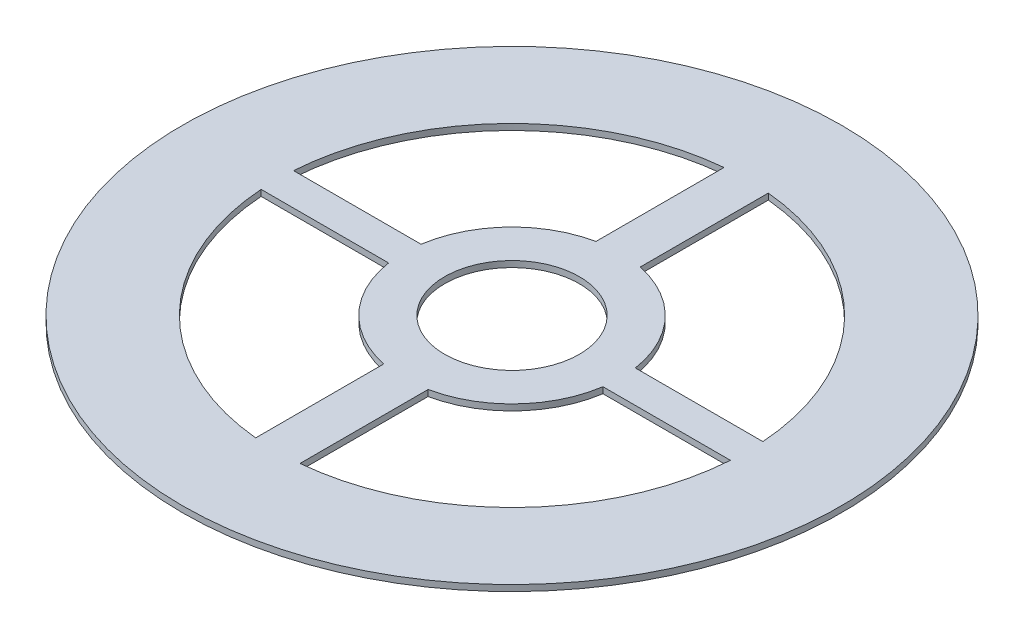
ISO-10303-21;
HEADER;
FILE_DESCRIPTION(('STEP AP214'),'2;1');
FILE_NAME('part.step','',(''),(''),'','','');
FILE_SCHEMA(('AUTOMOTIVE_DESIGN { 1 0 10303 214 1 1 1 1 }'));
ENDSEC;
DATA;
#1=APPLICATION_CONTEXT('core data for automotive mechanical design processes');
#2=APPLICATION_PROTOCOL_DEFINITION('international standard','automotive_design',2000,#1);
#3=PRODUCT_CONTEXT('',#1,'mechanical');
#4=PRODUCT('Part','Part','',(#3));
#5=PRODUCT_RELATED_PRODUCT_CATEGORY('part','',(#4));
#6=PRODUCT_DEFINITION_FORMATION('','',#4);
#7=PRODUCT_DEFINITION_CONTEXT('part definition',#1,'design');
#8=PRODUCT_DEFINITION('design','',#6,#7);
#9=PRODUCT_DEFINITION_SHAPE('','',#8);
#10=(LENGTH_UNIT() NAMED_UNIT(*) SI_UNIT(.MILLI.,.METRE.));
#11=(NAMED_UNIT(*) PLANE_ANGLE_UNIT() SI_UNIT($,.RADIAN.));
#12=(NAMED_UNIT(*) SI_UNIT($,.STERADIAN.) SOLID_ANGLE_UNIT());
#13=UNCERTAINTY_MEASURE_WITH_UNIT(LENGTH_MEASURE(1.E-05),#10,'distance_accuracy_value','');
#14=(GEOMETRIC_REPRESENTATION_CONTEXT(3) GLOBAL_UNCERTAINTY_ASSIGNED_CONTEXT((#13)) GLOBAL_UNIT_ASSIGNED_CONTEXT((#10,
#11,#12)) REPRESENTATION_CONTEXT('',''));
#15=CARTESIAN_POINT('',(0.,0.,0.));
#16=DIRECTION('',(0.,0.,1.));
#17=DIRECTION('',(1.,0.,0.));
#18=AXIS2_PLACEMENT_3D('',#15,#16,#17);
#19=CARTESIAN_POINT('',(0.,3.,0.));
#20=DIRECTION('',(0.,1.,0.));
#21=DIRECTION('',(0.,0.,1.));
#22=AXIS2_PLACEMENT_3D('',#19,#20,#21);
#23=PLANE('',#22);
#24=DIRECTION('',(1.,0.,0.));
#25=VECTOR('',#24,1.);
#26=CARTESIAN_POINT('',(-115.082927495968,3.,-7.95600567614442));
#27=LINE('',#26,#25);
#28=CARTESIAN_POINT('',(-115.082927495968,3.,-7.95600567614442));
#29=VERTEX_POINT('',#28);
#30=CARTESIAN_POINT('',(-52.5482500782004,3.,-7.95600567614442));
#31=VERTEX_POINT('',#30);
#32=EDGE_CURVE('E252',#29,#31,#27,.T.);
#33=ORIENTED_EDGE('',*,*,#32,.F.);
#34=CARTESIAN_POINT('',(0.,3.,0.));
#35=DIRECTION('',(0.,1.,0.));
#36=DIRECTION('',(0.,0.,1.));
#37=AXIS2_PLACEMENT_3D('',#34,#35,#36);
#38=CIRCLE('',#37,115.357610183988);
#39=CARTESIAN_POINT('',(-10.860579176959,3.,-114.845226488967));
#40=VERTEX_POINT('',#39);
#41=EDGE_CURVE('E250',#40,#29,#38,.T.);
#42=ORIENTED_EDGE('',*,*,#41,.F.);
#43=DIRECTION('',(0.,0.,-1.));
#44=VECTOR('',#43,1.);
#45=CARTESIAN_POINT('',(-10.860579176959,3.,-52.0256132356067));
#46=LINE('',#45,#44);
#47=CARTESIAN_POINT('',(-10.860579176959,3.,-52.0256132356067));
#48=VERTEX_POINT('',#47);
#49=EDGE_CURVE('E258',#48,#40,#46,.T.);
#50=ORIENTED_EDGE('',*,*,#49,.F.);
#51=CARTESIAN_POINT('',(0.,3.,0.));
#52=DIRECTION('',(0.,-1.,0.));
#53=DIRECTION('',(0.,0.,1.));
#54=AXIS2_PLACEMENT_3D('',#51,#52,#53);
#55=CIRCLE('',#54,53.1471223360205);
#56=EDGE_CURVE('E255',#31,#48,#55,.T.);
#57=ORIENTED_EDGE('',*,*,#56,.F.);
#58=EDGE_LOOP('',(#33,#42,#50,#57));
#59=FACE_BOUND('',#58,.T.);
#60=CARTESIAN_POINT('',(0.,3.,0.));
#61=DIRECTION('',(0.,1.,0.));
#62=DIRECTION('',(0.,0.,1.));
#63=AXIS2_PLACEMENT_3D('',#60,#61,#62);
#64=CIRCLE('',#63,161.62626275878);
#65=CARTESIAN_POINT('',(0.,3.,161.62626275878));
#66=VERTEX_POINT('',#65);
#67=EDGE_CURVE('E11',#66,#66,#64,.T.);
#68=ORIENTED_EDGE('',*,*,#67,.T.);
#69=EDGE_LOOP('',(#68));
#70=FACE_BOUND('',#69,.T.);
#71=CARTESIAN_POINT('',(0.,3.,0.));
#72=DIRECTION('',(0.,1.,0.));
#73=DIRECTION('',(0.,0.,1.));
#74=AXIS2_PLACEMENT_3D('',#71,#72,#73);
#75=CIRCLE('',#74,33.0195723251386);
#76=CARTESIAN_POINT('',(0.,3.,33.0195723251386));
#77=VERTEX_POINT('',#76);
#78=EDGE_CURVE('E244',#77,#77,#75,.T.);
#79=ORIENTED_EDGE('',*,*,#78,.F.);
#80=EDGE_LOOP('',(#79));
#81=FACE_BOUND('',#80,.T.);
#82=DIRECTION('',(0.,0.,1.));
#83=VECTOR('',#82,1.);
#84=CARTESIAN_POINT('',(10.860579176959,3.,114.845226488967));
#85=LINE('',#84,#83);
#86=CARTESIAN_POINT('',(10.860579176959,3.,52.0256132356067));
#87=VERTEX_POINT('',#86);
#88=CARTESIAN_POINT('',(10.860579176959,3.,114.845226488967));
#89=VERTEX_POINT('',#88);
#90=EDGE_CURVE('E215',#87,#89,#85,.T.);
#91=ORIENTED_EDGE('',*,*,#90,.F.);
#92=CARTESIAN_POINT('',(0.,3.,0.));
#93=DIRECTION('',(0.,-1.,0.));
#94=DIRECTION('',(0.,0.,1.));
#95=AXIS2_PLACEMENT_3D('',#92,#93,#94);
#96=CIRCLE('',#95,53.1471223360205);
#97=CARTESIAN_POINT('',(52.5482500782004,3.,7.95600567614442));
#98=VERTEX_POINT('',#97);
#99=EDGE_CURVE('E213',#98,#87,#96,.T.);
#100=ORIENTED_EDGE('',*,*,#99,.F.);
#101=DIRECTION('',(-1.,0.,0.));
#102=VECTOR('',#101,1.);
#103=CARTESIAN_POINT('',(52.5482500782004,3.,7.95600567614442));
#104=LINE('',#103,#102);
#105=CARTESIAN_POINT('',(115.082927495968,3.,7.95600567614442));
#106=VERTEX_POINT('',#105);
#107=EDGE_CURVE('E221',#106,#98,#104,.T.);
#108=ORIENTED_EDGE('',*,*,#107,.F.);
#109=CARTESIAN_POINT('',(0.,3.,0.));
#110=DIRECTION('',(0.,1.,0.));
#111=DIRECTION('',(0.,0.,1.));
#112=AXIS2_PLACEMENT_3D('',#109,#110,#111);
#113=CIRCLE('',#112,115.357610183988);
#114=EDGE_CURVE('E218',#89,#106,#113,.T.);
#115=ORIENTED_EDGE('',*,*,#114,.F.);
#116=EDGE_LOOP('',(#91,#100,#108,#115));
#117=FACE_BOUND('',#116,.T.);
#118=DIRECTION('',(-1.,0.,0.));
#119=VECTOR('',#118,1.);
#120=CARTESIAN_POINT('',(-115.082927495968,3.,7.95600567614442));
#121=LINE('',#120,#119);
#122=CARTESIAN_POINT('',(-52.5482500782004,3.,7.95600567614442));
#123=VERTEX_POINT('',#122);
#124=CARTESIAN_POINT('',(-115.082927495968,3.,7.95600567614442));
#125=VERTEX_POINT('',#124);
#126=EDGE_CURVE('E184',#123,#125,#121,.T.);
#127=ORIENTED_EDGE('',*,*,#126,.F.);
#128=CARTESIAN_POINT('',(0.,3.,0.));
#129=DIRECTION('',(0.,-1.,0.));
#130=DIRECTION('',(0.,0.,1.));
#131=AXIS2_PLACEMENT_3D('',#128,#129,#130);
#132=CIRCLE('',#131,53.1471223360205);
#133=CARTESIAN_POINT('',(-10.860579176959,3.,52.0256132356067));
#134=VERTEX_POINT('',#133);
#135=EDGE_CURVE('E182',#134,#123,#132,.T.);
#136=ORIENTED_EDGE('',*,*,#135,.F.);
#137=DIRECTION('',(0.,0.,-1.));
#138=VECTOR('',#137,1.);
#139=CARTESIAN_POINT('',(-10.860579176959,3.,114.845226488967));
#140=LINE('',#139,#138);
#141=CARTESIAN_POINT('',(-10.860579176959,3.,114.845226488967));
#142=VERTEX_POINT('',#141);
#143=EDGE_CURVE('E190',#142,#134,#140,.T.);
#144=ORIENTED_EDGE('',*,*,#143,.F.);
#145=CARTESIAN_POINT('',(0.,3.,0.));
#146=DIRECTION('',(0.,1.,0.));
#147=DIRECTION('',(0.,0.,1.));
#148=AXIS2_PLACEMENT_3D('',#145,#146,#147);
#149=CIRCLE('',#148,115.357610183988);
#150=EDGE_CURVE('E187',#125,#142,#149,.T.);
#151=ORIENTED_EDGE('',*,*,#150,.F.);
#152=EDGE_LOOP('',(#127,#136,#144,#151));
#153=FACE_BOUND('',#152,.T.);
#154=DIRECTION('',(1.,0.,0.));
#155=VECTOR('',#154,1.);
#156=CARTESIAN_POINT('',(52.5482500782004,3.,-7.95600567614442));
#157=LINE('',#156,#155);
#158=CARTESIAN_POINT('',(52.5482500782004,3.,-7.95600567614442));
#159=VERTEX_POINT('',#158);
#160=CARTESIAN_POINT('',(115.082927495968,3.,-7.95600567614442));
#161=VERTEX_POINT('',#160);
#162=EDGE_CURVE('E154',#159,#161,#157,.T.);
#163=ORIENTED_EDGE('',*,*,#162,.F.);
#164=CARTESIAN_POINT('',(0.,3.,0.));
#165=DIRECTION('',(0.,-1.,0.));
#166=DIRECTION('',(0.,0.,1.));
#167=AXIS2_PLACEMENT_3D('',#164,#165,#166);
#168=CIRCLE('',#167,53.1471223360205);
#169=CARTESIAN_POINT('',(10.860579176959,3.,-52.0256132356067));
#170=VERTEX_POINT('',#169);
#171=EDGE_CURVE('E146',#170,#159,#168,.T.);
#172=ORIENTED_EDGE('',*,*,#171,.F.);
#173=DIRECTION('',(0.,0.,1.));
#174=VECTOR('',#173,1.);
#175=CARTESIAN_POINT('',(10.860579176959,3.,-52.0256132356067));
#176=LINE('',#175,#174);
#177=CARTESIAN_POINT('',(10.860579176959,3.,-114.845226488967));
#178=VERTEX_POINT('',#177);
#179=EDGE_CURVE('E168',#178,#170,#176,.T.);
#180=ORIENTED_EDGE('',*,*,#179,.F.);
#181=CARTESIAN_POINT('',(0.,3.,0.));
#182=DIRECTION('',(0.,1.,0.));
#183=DIRECTION('',(0.,0.,1.));
#184=AXIS2_PLACEMENT_3D('',#181,#182,#183);
#185=CIRCLE('',#184,115.357610183988);
#186=EDGE_CURVE('E166',#161,#178,#185,.T.);
#187=ORIENTED_EDGE('',*,*,#186,.F.);
#188=EDGE_LOOP('',(#163,#172,#180,#187));
#189=FACE_BOUND('',#188,.T.);
#190=ADVANCED_FACE('F33',(#59,#70,#81,#117,#153,#189),#23,.T.);
#191=CARTESIAN_POINT('',(0.,0.,0.));
#192=DIRECTION('',(0.,1.,0.));
#193=DIRECTION('',(0.,0.,1.));
#194=AXIS2_PLACEMENT_3D('',#191,#192,#193);
#195=PLANE('',#194);
#196=CARTESIAN_POINT('',(0.,0.,0.));
#197=DIRECTION('',(0.,-1.,0.));
#198=DIRECTION('',(0.,0.,1.));
#199=AXIS2_PLACEMENT_3D('',#196,#197,#198);
#200=CIRCLE('',#199,53.1471223360205);
#201=CARTESIAN_POINT('',(-10.860579176959,0.,52.0256132356067));
#202=VERTEX_POINT('',#201);
#203=CARTESIAN_POINT('',(-52.5482500782004,0.,7.95600567614442));
#204=VERTEX_POINT('',#203);
#205=EDGE_CURVE('E162',#202,#204,#200,.T.);
#206=ORIENTED_EDGE('',*,*,#205,.T.);
#207=DIRECTION('',(-1.,0.,0.));
#208=VECTOR('',#207,1.);
#209=CARTESIAN_POINT('',(-115.082927495968,0.,7.95600567614442));
#210=LINE('',#209,#208);
#211=CARTESIAN_POINT('',(-115.082927495968,0.,7.95600567614442));
#212=VERTEX_POINT('',#211);
#213=EDGE_CURVE('E195',#204,#212,#210,.T.);
#214=ORIENTED_EDGE('',*,*,#213,.T.);
#215=CARTESIAN_POINT('',(0.,0.,0.));
#216=DIRECTION('',(0.,1.,0.));
#217=DIRECTION('',(0.,0.,1.));
#218=AXIS2_PLACEMENT_3D('',#215,#216,#217);
#219=CIRCLE('',#218,115.357610183988);
#220=CARTESIAN_POINT('',(-10.860579176959,0.,114.845226488967));
#221=VERTEX_POINT('',#220);
#222=EDGE_CURVE('E198',#212,#221,#219,.T.);
#223=ORIENTED_EDGE('',*,*,#222,.T.);
#224=DIRECTION('',(0.,0.,-1.));
#225=VECTOR('',#224,1.);
#226=CARTESIAN_POINT('',(-10.860579176959,0.,114.845226488967));
#227=LINE('',#226,#225);
#228=EDGE_CURVE('E185',#221,#202,#227,.T.);
#229=ORIENTED_EDGE('',*,*,#228,.T.);
#230=EDGE_LOOP('',(#206,#214,#223,#229));
#231=FACE_BOUND('',#230,.T.);
#232=CARTESIAN_POINT('',(0.,0.,0.));
#233=DIRECTION('',(0.,1.,0.));
#234=DIRECTION('',(0.,0.,1.));
#235=AXIS2_PLACEMENT_3D('',#232,#233,#234);
#236=CIRCLE('',#235,33.0195723251386);
#237=CARTESIAN_POINT('',(0.,0.,33.0195723251386));
#238=VERTEX_POINT('',#237);
#239=EDGE_CURVE('E243',#238,#238,#236,.T.);
#240=ORIENTED_EDGE('',*,*,#239,.T.);
#241=EDGE_LOOP('',(#240));
#242=FACE_BOUND('',#241,.T.);
#243=CARTESIAN_POINT('',(0.,0.,0.));
#244=DIRECTION('',(0.,1.,0.));
#245=DIRECTION('',(0.,0.,1.));
#246=AXIS2_PLACEMENT_3D('',#243,#244,#245);
#247=CIRCLE('',#246,115.357610183988);
#248=CARTESIAN_POINT('',(-10.860579176959,0.,-114.845226488967));
#249=VERTEX_POINT('',#248);
#250=CARTESIAN_POINT('',(-115.082927495968,0.,-7.95600567614442));
#251=VERTEX_POINT('',#250);
#252=EDGE_CURVE('E247',#249,#251,#247,.T.);
#253=ORIENTED_EDGE('',*,*,#252,.T.);
#254=DIRECTION('',(1.,0.,0.));
#255=VECTOR('',#254,1.);
#256=CARTESIAN_POINT('',(-115.082927495968,0.,-7.95600567614442));
#257=LINE('',#256,#255);
#258=CARTESIAN_POINT('',(-52.5482500782004,0.,-7.95600567614442));
#259=VERTEX_POINT('',#258);
#260=EDGE_CURVE('E263',#251,#259,#257,.T.);
#261=ORIENTED_EDGE('',*,*,#260,.T.);
#262=CARTESIAN_POINT('',(0.,0.,0.));
#263=DIRECTION('',(0.,-1.,0.));
#264=DIRECTION('',(0.,0.,1.));
#265=AXIS2_PLACEMENT_3D('',#262,#263,#264);
#266=CIRCLE('',#265,53.1471223360205);
#267=CARTESIAN_POINT('',(-10.860579176959,0.,-52.0256132356067));
#268=VERTEX_POINT('',#267);
#269=EDGE_CURVE('E266',#259,#268,#266,.T.);
#270=ORIENTED_EDGE('',*,*,#269,.T.);
#271=DIRECTION('',(0.,0.,-1.));
#272=VECTOR('',#271,1.);
#273=CARTESIAN_POINT('',(-10.860579176959,0.,-52.0256132356067));
#274=LINE('',#273,#272);
#275=EDGE_CURVE('E253',#268,#249,#274,.T.);
#276=ORIENTED_EDGE('',*,*,#275,.T.);
#277=EDGE_LOOP('',(#253,#261,#270,#276));
#278=FACE_BOUND('',#277,.T.);
#279=CARTESIAN_POINT('',(0.,0.,0.));
#280=DIRECTION('',(0.,1.,0.));
#281=DIRECTION('',(0.,0.,1.));
#282=AXIS2_PLACEMENT_3D('',#279,#280,#281);
#283=CIRCLE('',#282,161.62626275878);
#284=CARTESIAN_POINT('',(0.,0.,161.62626275878));
#285=VERTEX_POINT('',#284);
#286=EDGE_CURVE('E37',#285,#285,#283,.T.);
#287=ORIENTED_EDGE('',*,*,#286,.F.);
#288=EDGE_LOOP('',(#287));
#289=FACE_BOUND('',#288,.T.);
#290=CARTESIAN_POINT('',(0.,0.,0.));
#291=DIRECTION('',(0.,-1.,0.));
#292=DIRECTION('',(0.,0.,1.));
#293=AXIS2_PLACEMENT_3D('',#290,#291,#292);
#294=CIRCLE('',#293,53.1471223360205);
#295=CARTESIAN_POINT('',(52.5482500782004,0.,7.95600567614442));
#296=VERTEX_POINT('',#295);
#297=CARTESIAN_POINT('',(10.860579176959,0.,52.0256132356067));
#298=VERTEX_POINT('',#297);
#299=EDGE_CURVE('E212',#296,#298,#294,.T.);
#300=ORIENTED_EDGE('',*,*,#299,.T.);
#301=DIRECTION('',(0.,0.,1.));
#302=VECTOR('',#301,1.);
#303=CARTESIAN_POINT('',(10.860579176959,0.,114.845226488967));
#304=LINE('',#303,#302);
#305=CARTESIAN_POINT('',(10.860579176959,0.,114.845226488967));
#306=VERTEX_POINT('',#305);
#307=EDGE_CURVE('E226',#298,#306,#304,.T.);
#308=ORIENTED_EDGE('',*,*,#307,.T.);
#309=CARTESIAN_POINT('',(0.,0.,0.));
#310=DIRECTION('',(0.,1.,0.));
#311=DIRECTION('',(0.,0.,1.));
#312=AXIS2_PLACEMENT_3D('',#309,#310,#311);
#313=CIRCLE('',#312,115.357610183988);
#314=CARTESIAN_POINT('',(115.082927495968,0.,7.95600567614442));
#315=VERTEX_POINT('',#314);
#316=EDGE_CURVE('E229',#306,#315,#313,.T.);
#317=ORIENTED_EDGE('',*,*,#316,.T.);
#318=DIRECTION('',(-1.,0.,0.));
#319=VECTOR('',#318,1.);
#320=CARTESIAN_POINT('',(52.5482500782004,0.,7.95600567614442));
#321=LINE('',#320,#319);
#322=EDGE_CURVE('E216',#315,#296,#321,.T.);
#323=ORIENTED_EDGE('',*,*,#322,.T.);
#324=EDGE_LOOP('',(#300,#308,#317,#323));
#325=FACE_BOUND('',#324,.T.);
#326=CARTESIAN_POINT('',(0.,0.,0.));
#327=DIRECTION('',(0.,-1.,0.));
#328=DIRECTION('',(0.,0.,1.));
#329=AXIS2_PLACEMENT_3D('',#326,#327,#328);
#330=CIRCLE('',#329,53.1471223360205);
#331=CARTESIAN_POINT('',(10.860579176959,0.,-52.0256132356067));
#332=VERTEX_POINT('',#331);
#333=CARTESIAN_POINT('',(52.5482500782004,0.,-7.95600567614442));
#334=VERTEX_POINT('',#333);
#335=EDGE_CURVE('E56',#332,#334,#330,.T.);
#336=ORIENTED_EDGE('',*,*,#335,.T.);
#337=DIRECTION('',(1.,0.,0.));
#338=VECTOR('',#337,1.);
#339=CARTESIAN_POINT('',(52.5482500782004,0.,-7.95600567614442));
#340=LINE('',#339,#338);
#341=CARTESIAN_POINT('',(115.082927495968,0.,-7.95600567614442));
#342=VERTEX_POINT('',#341);
#343=EDGE_CURVE('E161',#334,#342,#340,.T.);
#344=ORIENTED_EDGE('',*,*,#343,.T.);
#345=CARTESIAN_POINT('',(0.,0.,0.));
#346=DIRECTION('',(0.,1.,0.));
#347=DIRECTION('',(0.,0.,1.));
#348=AXIS2_PLACEMENT_3D('',#345,#346,#347);
#349=CIRCLE('',#348,115.357610183988);
#350=CARTESIAN_POINT('',(10.860579176959,0.,-114.845226488967));
#351=VERTEX_POINT('',#350);
#352=EDGE_CURVE('E174',#342,#351,#349,.T.);
#353=ORIENTED_EDGE('',*,*,#352,.T.);
#354=DIRECTION('',(0.,0.,1.));
#355=VECTOR('',#354,1.);
#356=CARTESIAN_POINT('',(10.860579176959,0.,-52.0256132356067));
#357=LINE('',#356,#355);
#358=EDGE_CURVE('E155',#351,#332,#357,.T.);
#359=ORIENTED_EDGE('',*,*,#358,.T.);
#360=EDGE_LOOP('',(#336,#344,#353,#359));
#361=FACE_BOUND('',#360,.T.);
#362=ADVANCED_FACE('F285',(#231,#242,#278,#289,#325,#361),#195,.F.);
#363=CARTESIAN_POINT('',(0.,3.,0.));
#364=DIRECTION('',(0.,-1.,0.));
#365=DIRECTION('',(0.,0.,-1.));
#366=AXIS2_PLACEMENT_3D('',#363,#364,#365);
#367=CYLINDRICAL_SURFACE('',#366,161.62626275878);
#368=ORIENTED_EDGE('',*,*,#67,.F.);
#369=EDGE_LOOP('',(#368));
#370=FACE_BOUND('',#369,.T.);
#371=ORIENTED_EDGE('',*,*,#286,.T.);
#372=EDGE_LOOP('',(#371));
#373=FACE_BOUND('',#372,.T.);
#374=ADVANCED_FACE('F35',(#370,#373),#367,.T.);
#375=CARTESIAN_POINT('',(0.,3.,0.));
#376=DIRECTION('',(0.,-1.,0.));
#377=DIRECTION('',(0.,0.,-1.));
#378=AXIS2_PLACEMENT_3D('',#375,#376,#377);
#379=CYLINDRICAL_SURFACE('',#378,115.357610183988);
#380=ORIENTED_EDGE('',*,*,#252,.F.);
#381=DIRECTION('',(0.,-1.,0.));
#382=VECTOR('',#381,1.);
#383=CARTESIAN_POINT('',(-10.860579176959,3.,-114.845226488967));
#384=LINE('',#383,#382);
#385=EDGE_CURVE('E260',#40,#249,#384,.T.);
#386=ORIENTED_EDGE('',*,*,#385,.F.);
#387=ORIENTED_EDGE('',*,*,#41,.T.);
#388=DIRECTION('',(0.,-1.,0.));
#389=VECTOR('',#388,1.);
#390=CARTESIAN_POINT('',(-115.082927495968,3.,-7.95600567614442));
#391=LINE('',#390,#389);
#392=EDGE_CURVE('E277',#29,#251,#391,.T.);
#393=ORIENTED_EDGE('',*,*,#392,.T.);
#394=EDGE_LOOP('',(#380,#386,#387,#393));
#395=FACE_BOUND('',#394,.T.);
#396=ADVANCED_FACE('F308',(#395),#379,.F.);
#397=CARTESIAN_POINT('',(-115.082927495968,3.,-7.95600567614442));
#398=DIRECTION('',(0.,0.,-1.));
#399=DIRECTION('',(-1.,0.,0.));
#400=AXIS2_PLACEMENT_3D('',#397,#398,#399);
#401=PLANE('',#400);
#402=ORIENTED_EDGE('',*,*,#260,.F.);
#403=ORIENTED_EDGE('',*,*,#392,.F.);
#404=ORIENTED_EDGE('',*,*,#32,.T.);
#405=DIRECTION('',(0.,-1.,0.));
#406=VECTOR('',#405,1.);
#407=CARTESIAN_POINT('',(-52.5482500782004,3.,-7.95600567614442));
#408=LINE('',#407,#406);
#409=EDGE_CURVE('E275',#31,#259,#408,.T.);
#410=ORIENTED_EDGE('',*,*,#409,.T.);
#411=EDGE_LOOP('',(#402,#403,#404,#410));
#412=FACE_BOUND('',#411,.T.);
#413=ADVANCED_FACE('F311',(#412),#401,.T.);
#414=CARTESIAN_POINT('',(0.,3.,0.));
#415=DIRECTION('',(0.,-1.,0.));
#416=DIRECTION('',(0.,0.,-1.));
#417=AXIS2_PLACEMENT_3D('',#414,#415,#416);
#418=CYLINDRICAL_SURFACE('',#417,53.1471223360205);
#419=ORIENTED_EDGE('',*,*,#269,.F.);
#420=ORIENTED_EDGE('',*,*,#409,.F.);
#421=ORIENTED_EDGE('',*,*,#56,.T.);
#422=DIRECTION('',(0.,-1.,0.));
#423=VECTOR('',#422,1.);
#424=CARTESIAN_POINT('',(-10.860579176959,3.,-52.0256132356067));
#425=LINE('',#424,#423);
#426=EDGE_CURVE('E273',#48,#268,#425,.T.);
#427=ORIENTED_EDGE('',*,*,#426,.T.);
#428=EDGE_LOOP('',(#419,#420,#421,#427));
#429=FACE_BOUND('',#428,.T.);
#430=ADVANCED_FACE('F314',(#429),#418,.T.);
#431=CARTESIAN_POINT('',(-10.860579176959,3.,-52.0256132356067));
#432=DIRECTION('',(-1.,0.,0.));
#433=DIRECTION('',(0.,0.,1.));
#434=AXIS2_PLACEMENT_3D('',#431,#432,#433);
#435=PLANE('',#434);
#436=ORIENTED_EDGE('',*,*,#275,.F.);
#437=ORIENTED_EDGE('',*,*,#426,.F.);
#438=ORIENTED_EDGE('',*,*,#49,.T.);
#439=ORIENTED_EDGE('',*,*,#385,.T.);
#440=EDGE_LOOP('',(#436,#437,#438,#439));
#441=FACE_BOUND('',#440,.T.);
#442=ADVANCED_FACE('F318',(#441),#435,.T.);
#443=CARTESIAN_POINT('',(0.,3.,0.));
#444=DIRECTION('',(0.,-1.,0.));
#445=DIRECTION('',(0.,0.,-1.));
#446=AXIS2_PLACEMENT_3D('',#443,#444,#445);
#447=CYLINDRICAL_SURFACE('',#446,33.0195723251386);
#448=ORIENTED_EDGE('',*,*,#78,.T.);
#449=EDGE_LOOP('',(#448));
#450=FACE_BOUND('',#449,.T.);
#451=ORIENTED_EDGE('',*,*,#239,.F.);
#452=EDGE_LOOP('',(#451));
#453=FACE_BOUND('',#452,.T.);
#454=ADVANCED_FACE('F322',(#450,#453),#447,.F.);
#455=CARTESIAN_POINT('',(0.,3.,0.));
#456=DIRECTION('',(0.,-1.,0.));
#457=DIRECTION('',(0.,0.,-1.));
#458=AXIS2_PLACEMENT_3D('',#455,#456,#457);
#459=CYLINDRICAL_SURFACE('',#458,53.1471223360205);
#460=ORIENTED_EDGE('',*,*,#299,.F.);
#461=DIRECTION('',(0.,-1.,0.));
#462=VECTOR('',#461,1.);
#463=CARTESIAN_POINT('',(52.5482500782004,3.,7.95600567614442));
#464=LINE('',#463,#462);
#465=EDGE_CURVE('E223',#98,#296,#464,.T.);
#466=ORIENTED_EDGE('',*,*,#465,.F.);
#467=ORIENTED_EDGE('',*,*,#99,.T.);
#468=DIRECTION('',(0.,-1.,0.));
#469=VECTOR('',#468,1.);
#470=CARTESIAN_POINT('',(10.860579176959,3.,52.0256132356067));
#471=LINE('',#470,#469);
#472=EDGE_CURVE('E240',#87,#298,#471,.T.);
#473=ORIENTED_EDGE('',*,*,#472,.T.);
#474=EDGE_LOOP('',(#460,#466,#467,#473));
#475=FACE_BOUND('',#474,.T.);
#476=ADVANCED_FACE('F326',(#475),#459,.T.);
#477=CARTESIAN_POINT('',(10.860579176959,3.,114.845226488967));
#478=DIRECTION('',(1.,0.,0.));
#479=DIRECTION('',(0.,0.,-1.));
#480=AXIS2_PLACEMENT_3D('',#477,#478,#479);
#481=PLANE('',#480);
#482=ORIENTED_EDGE('',*,*,#307,.F.);
#483=ORIENTED_EDGE('',*,*,#472,.F.);
#484=ORIENTED_EDGE('',*,*,#90,.T.);
#485=DIRECTION('',(0.,-1.,0.));
#486=VECTOR('',#485,1.);
#487=CARTESIAN_POINT('',(10.860579176959,3.,114.845226488967));
#488=LINE('',#487,#486);
#489=EDGE_CURVE('E238',#89,#306,#488,.T.);
#490=ORIENTED_EDGE('',*,*,#489,.T.);
#491=EDGE_LOOP('',(#482,#483,#484,#490));
#492=FACE_BOUND('',#491,.T.);
#493=ADVANCED_FACE('F330',(#492),#481,.T.);
#494=CARTESIAN_POINT('',(0.,3.,0.));
#495=DIRECTION('',(0.,-1.,0.));
#496=DIRECTION('',(0.,0.,-1.));
#497=AXIS2_PLACEMENT_3D('',#494,#495,#496);
#498=CYLINDRICAL_SURFACE('',#497,115.357610183988);
#499=ORIENTED_EDGE('',*,*,#316,.F.);
#500=ORIENTED_EDGE('',*,*,#489,.F.);
#501=ORIENTED_EDGE('',*,*,#114,.T.);
#502=DIRECTION('',(0.,-1.,0.));
#503=VECTOR('',#502,1.);
#504=CARTESIAN_POINT('',(115.082927495968,3.,7.95600567614442));
#505=LINE('',#504,#503);
#506=EDGE_CURVE('E236',#106,#315,#505,.T.);
#507=ORIENTED_EDGE('',*,*,#506,.T.);
#508=EDGE_LOOP('',(#499,#500,#501,#507));
#509=FACE_BOUND('',#508,.T.);
#510=ADVANCED_FACE('F334',(#509),#498,.F.);
#511=CARTESIAN_POINT('',(52.5482500782004,3.,7.95600567614442));
#512=DIRECTION('',(0.,0.,1.));
#513=DIRECTION('',(1.,0.,0.));
#514=AXIS2_PLACEMENT_3D('',#511,#512,#513);
#515=PLANE('',#514);
#516=ORIENTED_EDGE('',*,*,#322,.F.);
#517=ORIENTED_EDGE('',*,*,#506,.F.);
#518=ORIENTED_EDGE('',*,*,#107,.T.);
#519=ORIENTED_EDGE('',*,*,#465,.T.);
#520=EDGE_LOOP('',(#516,#517,#518,#519));
#521=FACE_BOUND('',#520,.T.);
#522=ADVANCED_FACE('F338',(#521),#515,.T.);
#523=CARTESIAN_POINT('',(0.,3.,0.));
#524=DIRECTION('',(0.,-1.,0.));
#525=DIRECTION('',(0.,0.,-1.));
#526=AXIS2_PLACEMENT_3D('',#523,#524,#525);
#527=CYLINDRICAL_SURFACE('',#526,53.1471223360205);
#528=ORIENTED_EDGE('',*,*,#205,.F.);
#529=DIRECTION('',(0.,-1.,0.));
#530=VECTOR('',#529,1.);
#531=CARTESIAN_POINT('',(-10.860579176959,3.,52.0256132356067));
#532=LINE('',#531,#530);
#533=EDGE_CURVE('E192',#134,#202,#532,.T.);
#534=ORIENTED_EDGE('',*,*,#533,.F.);
#535=ORIENTED_EDGE('',*,*,#135,.T.);
#536=DIRECTION('',(0.,-1.,0.));
#537=VECTOR('',#536,1.);
#538=CARTESIAN_POINT('',(-52.5482500782004,3.,7.95600567614442));
#539=LINE('',#538,#537);
#540=EDGE_CURVE('E209',#123,#204,#539,.T.);
#541=ORIENTED_EDGE('',*,*,#540,.T.);
#542=EDGE_LOOP('',(#528,#534,#535,#541));
#543=FACE_BOUND('',#542,.T.);
#544=ADVANCED_FACE('F342',(#543),#527,.T.);
#545=CARTESIAN_POINT('',(-115.082927495968,3.,7.95600567614442));
#546=DIRECTION('',(0.,0.,1.));
#547=DIRECTION('',(1.,0.,0.));
#548=AXIS2_PLACEMENT_3D('',#545,#546,#547);
#549=PLANE('',#548);
#550=ORIENTED_EDGE('',*,*,#213,.F.);
#551=ORIENTED_EDGE('',*,*,#540,.F.);
#552=ORIENTED_EDGE('',*,*,#126,.T.);
#553=DIRECTION('',(0.,-1.,0.));
#554=VECTOR('',#553,1.);
#555=CARTESIAN_POINT('',(-115.082927495968,3.,7.95600567614442));
#556=LINE('',#555,#554);
#557=EDGE_CURVE('E207',#125,#212,#556,.T.);
#558=ORIENTED_EDGE('',*,*,#557,.T.);
#559=EDGE_LOOP('',(#550,#551,#552,#558));
#560=FACE_BOUND('',#559,.T.);
#561=ADVANCED_FACE('F346',(#560),#549,.T.);
#562=CARTESIAN_POINT('',(0.,3.,0.));
#563=DIRECTION('',(0.,-1.,0.));
#564=DIRECTION('',(0.,0.,-1.));
#565=AXIS2_PLACEMENT_3D('',#562,#563,#564);
#566=CYLINDRICAL_SURFACE('',#565,115.357610183988);
#567=ORIENTED_EDGE('',*,*,#222,.F.);
#568=ORIENTED_EDGE('',*,*,#557,.F.);
#569=ORIENTED_EDGE('',*,*,#150,.T.);
#570=DIRECTION('',(0.,-1.,0.));
#571=VECTOR('',#570,1.);
#572=CARTESIAN_POINT('',(-10.860579176959,3.,114.845226488967));
#573=LINE('',#572,#571);
#574=EDGE_CURVE('E205',#142,#221,#573,.T.);
#575=ORIENTED_EDGE('',*,*,#574,.T.);
#576=EDGE_LOOP('',(#567,#568,#569,#575));
#577=FACE_BOUND('',#576,.T.);
#578=ADVANCED_FACE('F350',(#577),#566,.F.);
#579=CARTESIAN_POINT('',(-10.860579176959,3.,114.845226488967));
#580=DIRECTION('',(-1.,0.,0.));
#581=DIRECTION('',(0.,0.,1.));
#582=AXIS2_PLACEMENT_3D('',#579,#580,#581);
#583=PLANE('',#582);
#584=ORIENTED_EDGE('',*,*,#228,.F.);
#585=ORIENTED_EDGE('',*,*,#574,.F.);
#586=ORIENTED_EDGE('',*,*,#143,.T.);
#587=ORIENTED_EDGE('',*,*,#533,.T.);
#588=EDGE_LOOP('',(#584,#585,#586,#587));
#589=FACE_BOUND('',#588,.T.);
#590=ADVANCED_FACE('F354',(#589),#583,.T.);
#591=CARTESIAN_POINT('',(0.,3.,0.));
#592=DIRECTION('',(0.,-1.,0.));
#593=DIRECTION('',(0.,0.,-1.));
#594=AXIS2_PLACEMENT_3D('',#591,#592,#593);
#595=CYLINDRICAL_SURFACE('',#594,53.1471223360205);
#596=ORIENTED_EDGE('',*,*,#335,.F.);
#597=DIRECTION('',(0.,-1.,0.));
#598=VECTOR('',#597,1.);
#599=CARTESIAN_POINT('',(10.860579176959,3.,-52.0256132356067));
#600=LINE('',#599,#598);
#601=EDGE_CURVE('E150',#170,#332,#600,.T.);
#602=ORIENTED_EDGE('',*,*,#601,.F.);
#603=ORIENTED_EDGE('',*,*,#171,.T.);
#604=DIRECTION('',(0.,-1.,0.));
#605=VECTOR('',#604,1.);
#606=CARTESIAN_POINT('',(52.5482500782004,3.,-7.95600567614442));
#607=LINE('',#606,#605);
#608=EDGE_CURVE('E149',#159,#334,#607,.T.);
#609=ORIENTED_EDGE('',*,*,#608,.T.);
#610=EDGE_LOOP('',(#596,#602,#603,#609));
#611=FACE_BOUND('',#610,.T.);
#612=ADVANCED_FACE('F148',(#611),#595,.T.);
#613=CARTESIAN_POINT('',(52.5482500782004,3.,-7.95600567614442));
#614=DIRECTION('',(0.,0.,-1.));
#615=DIRECTION('',(-1.,0.,0.));
#616=AXIS2_PLACEMENT_3D('',#613,#614,#615);
#617=PLANE('',#616);
#618=ORIENTED_EDGE('',*,*,#343,.F.);
#619=ORIENTED_EDGE('',*,*,#608,.F.);
#620=ORIENTED_EDGE('',*,*,#162,.T.);
#621=DIRECTION('',(0.,-1.,0.));
#622=VECTOR('',#621,1.);
#623=CARTESIAN_POINT('',(115.082927495968,3.,-7.95600567614442));
#624=LINE('',#623,#622);
#625=EDGE_CURVE('E163',#161,#342,#624,.T.);
#626=ORIENTED_EDGE('',*,*,#625,.T.);
#627=EDGE_LOOP('',(#618,#619,#620,#626));
#628=FACE_BOUND('',#627,.T.);
#629=ADVANCED_FACE('F158',(#628),#617,.T.);
#630=CARTESIAN_POINT('',(0.,3.,0.));
#631=DIRECTION('',(0.,-1.,0.));
#632=DIRECTION('',(0.,0.,-1.));
#633=AXIS2_PLACEMENT_3D('',#630,#631,#632);
#634=CYLINDRICAL_SURFACE('',#633,115.357610183988);
#635=ORIENTED_EDGE('',*,*,#352,.F.);
#636=ORIENTED_EDGE('',*,*,#625,.F.);
#637=ORIENTED_EDGE('',*,*,#186,.T.);
#638=DIRECTION('',(0.,-1.,0.));
#639=VECTOR('',#638,1.);
#640=CARTESIAN_POINT('',(10.860579176959,3.,-114.845226488967));
#641=LINE('',#640,#639);
#642=EDGE_CURVE('E48',#178,#351,#641,.T.);
#643=ORIENTED_EDGE('',*,*,#642,.T.);
#644=EDGE_LOOP('',(#635,#636,#637,#643));
#645=FACE_BOUND('',#644,.T.);
#646=ADVANCED_FACE('F293',(#645),#634,.F.);
#647=CARTESIAN_POINT('',(10.860579176959,3.,-52.0256132356067));
#648=DIRECTION('',(1.,0.,0.));
#649=DIRECTION('',(0.,0.,-1.));
#650=AXIS2_PLACEMENT_3D('',#647,#648,#649);
#651=PLANE('',#650);
#652=ORIENTED_EDGE('',*,*,#358,.F.);
#653=ORIENTED_EDGE('',*,*,#642,.F.);
#654=ORIENTED_EDGE('',*,*,#179,.T.);
#655=ORIENTED_EDGE('',*,*,#601,.T.);
#656=EDGE_LOOP('',(#652,#653,#654,#655));
#657=FACE_BOUND('',#656,.T.);
#658=ADVANCED_FACE('F291',(#657),#651,.T.);
#659=CLOSED_SHELL('',(#190,#362,#374,#396,#413,#430,#442,#454,#476,#493,#510,#522,#544,#561,
#578,#590,#612,#629,#646,#658));
#660=MANIFOLD_SOLID_BREP('B2',#659);
#661=ADVANCED_BREP_SHAPE_REPRESENTATION('',(#18,#660),#14);
#662=SHAPE_DEFINITION_REPRESENTATION(#9,#661);
ENDSEC;
END-ISO-10303-21;
